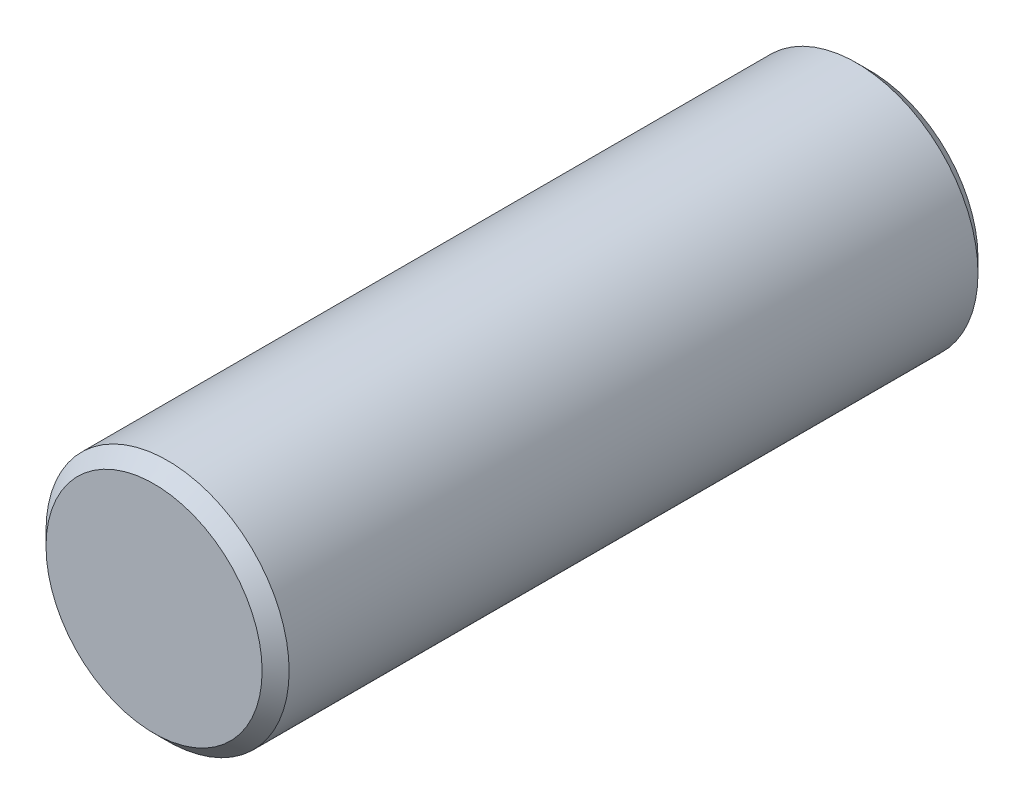
ISO-10303-21;
HEADER;
FILE_DESCRIPTION(('STEP AP214'),'2;1');
FILE_NAME('part.step','',(''),(''),'','','');
FILE_SCHEMA(('AUTOMOTIVE_DESIGN { 1 0 10303 214 1 1 1 1 }'));
ENDSEC;
DATA;
#1=APPLICATION_CONTEXT('core data for automotive mechanical design processes');
#2=APPLICATION_PROTOCOL_DEFINITION('international standard','automotive_design',2000,#1);
#3=PRODUCT_CONTEXT('',#1,'mechanical');
#4=PRODUCT('Part','Part','',(#3));
#5=PRODUCT_RELATED_PRODUCT_CATEGORY('part','',(#4));
#6=PRODUCT_DEFINITION_FORMATION('','',#4);
#7=PRODUCT_DEFINITION_CONTEXT('part definition',#1,'design');
#8=PRODUCT_DEFINITION('design','',#6,#7);
#9=PRODUCT_DEFINITION_SHAPE('','',#8);
#10=(LENGTH_UNIT() NAMED_UNIT(*) SI_UNIT(.MILLI.,.METRE.));
#11=(NAMED_UNIT(*) PLANE_ANGLE_UNIT() SI_UNIT($,.RADIAN.));
#12=(NAMED_UNIT(*) SI_UNIT($,.STERADIAN.) SOLID_ANGLE_UNIT());
#13=UNCERTAINTY_MEASURE_WITH_UNIT(LENGTH_MEASURE(1.E-05),#10,'distance_accuracy_value','');
#14=(GEOMETRIC_REPRESENTATION_CONTEXT(3) GLOBAL_UNCERTAINTY_ASSIGNED_CONTEXT((#13)) GLOBAL_UNIT_ASSIGNED_CONTEXT((#10,
#11,#12)) REPRESENTATION_CONTEXT('',''));
#15=CARTESIAN_POINT('',(0.,0.,0.));
#16=DIRECTION('',(0.,0.,1.));
#17=DIRECTION('',(1.,0.,0.));
#18=AXIS2_PLACEMENT_3D('',#15,#16,#17);
#19=CARTESIAN_POINT('',(0.,0.,53.));
#20=DIRECTION('',(0.,0.,-1.));
#21=DIRECTION('',(-1.,0.,0.));
#22=AXIS2_PLACEMENT_3D('',#19,#20,#21);
#23=CYLINDRICAL_SURFACE('',#22,9.);
#24=CARTESIAN_POINT('',(0.,0.,0.999999999999994));
#25=DIRECTION('',(0.,0.,1.));
#26=DIRECTION('',(1.,0.,0.));
#27=AXIS2_PLACEMENT_3D('',#24,#25,#26);
#28=CIRCLE('',#27,9.);
#29=CARTESIAN_POINT('',(9.,0.,0.999999999999994));
#30=VERTEX_POINT('',#29);
#31=EDGE_CURVE('E53',#30,#30,#28,.T.);
#32=ORIENTED_EDGE('',*,*,#31,.T.);
#33=EDGE_LOOP('',(#32));
#34=FACE_BOUND('',#33,.T.);
#35=CARTESIAN_POINT('',(0.,0.,52.));
#36=DIRECTION('',(0.,0.,1.));
#37=DIRECTION('',(1.,0.,0.));
#38=AXIS2_PLACEMENT_3D('',#35,#36,#37);
#39=CIRCLE('',#38,9.);
#40=CARTESIAN_POINT('',(9.,0.,52.));
#41=VERTEX_POINT('',#40);
#42=EDGE_CURVE('E57',#41,#41,#39,.F.);
#43=ORIENTED_EDGE('',*,*,#42,.T.);
#44=EDGE_LOOP('',(#43));
#45=FACE_BOUND('',#44,.T.);
#46=ADVANCED_FACE('F41',(#34,#45),#23,.T.);
#47=CARTESIAN_POINT('',(0.,0.,53.));
#48=DIRECTION('',(0.,0.,1.));
#49=DIRECTION('',(1.,0.,0.));
#50=AXIS2_PLACEMENT_3D('',#47,#48,#49);
#51=PLANE('',#50);
#52=CARTESIAN_POINT('',(0.,0.,53.));
#53=DIRECTION('',(0.,0.,1.));
#54=DIRECTION('',(1.,0.,0.));
#55=AXIS2_PLACEMENT_3D('',#52,#53,#54);
#56=CIRCLE('',#55,7.99999999999999);
#57=CARTESIAN_POINT('',(7.99999999999999,0.,53.));
#58=VERTEX_POINT('',#57);
#59=EDGE_CURVE('E10',#58,#58,#56,.T.);
#60=ORIENTED_EDGE('',*,*,#59,.T.);
#61=EDGE_LOOP('',(#60));
#62=FACE_BOUND('',#61,.T.);
#63=ADVANCED_FACE('F73',(#62),#51,.T.);
#64=CARTESIAN_POINT('',(0.,0.,0.));
#65=DIRECTION('',(0.,0.,1.));
#66=DIRECTION('',(1.,0.,0.));
#67=AXIS2_PLACEMENT_3D('',#64,#65,#66);
#68=PLANE('',#67);
#69=CARTESIAN_POINT('',(0.,0.,0.));
#70=DIRECTION('',(0.,0.,1.));
#71=DIRECTION('',(1.,0.,0.));
#72=AXIS2_PLACEMENT_3D('',#69,#70,#71);
#73=CIRCLE('',#72,8.00000000000001);
#74=CARTESIAN_POINT('',(8.00000000000001,0.,0.));
#75=VERTEX_POINT('',#74);
#76=EDGE_CURVE('E49',#75,#75,#73,.F.);
#77=ORIENTED_EDGE('',*,*,#76,.T.);
#78=EDGE_LOOP('',(#77));
#79=FACE_BOUND('',#78,.T.);
#80=ADVANCED_FACE('F70',(#79),#68,.F.);
#81=CARTESIAN_POINT('',(0.,0.,0.999999999999994));
#82=DIRECTION('',(0.,0.,1.));
#83=DIRECTION('',(1.,0.,0.));
#84=AXIS2_PLACEMENT_3D('',#81,#82,#83);
#85=CONICAL_SURFACE('',#84,9.,0.785398163397447);
#86=ORIENTED_EDGE('',*,*,#76,.F.);
#87=EDGE_LOOP('',(#86));
#88=FACE_BOUND('',#87,.T.);
#89=ORIENTED_EDGE('',*,*,#31,.F.);
#90=EDGE_LOOP('',(#89));
#91=FACE_BOUND('',#90,.T.);
#92=ADVANCED_FACE('F66',(#88,#91),#85,.T.);
#93=CARTESIAN_POINT('',(0.,0.,53.));
#94=DIRECTION('',(0.,0.,-1.));
#95=DIRECTION('',(-1.,0.,0.));
#96=AXIS2_PLACEMENT_3D('',#93,#94,#95);
#97=CONICAL_SURFACE('',#96,7.99999999999999,0.785398163397447);
#98=ORIENTED_EDGE('',*,*,#42,.F.);
#99=EDGE_LOOP('',(#98));
#100=FACE_BOUND('',#99,.T.);
#101=ORIENTED_EDGE('',*,*,#59,.F.);
#102=EDGE_LOOP('',(#101));
#103=FACE_BOUND('',#102,.T.);
#104=ADVANCED_FACE('F44',(#100,#103),#97,.T.);
#105=CLOSED_SHELL('',(#46,#63,#80,#92,#104));
#106=MANIFOLD_SOLID_BREP('B2',#105);
#107=ADVANCED_BREP_SHAPE_REPRESENTATION('',(#18,#106),#14);
#108=SHAPE_DEFINITION_REPRESENTATION(#9,#107);
ENDSEC;
END-ISO-10303-21;
